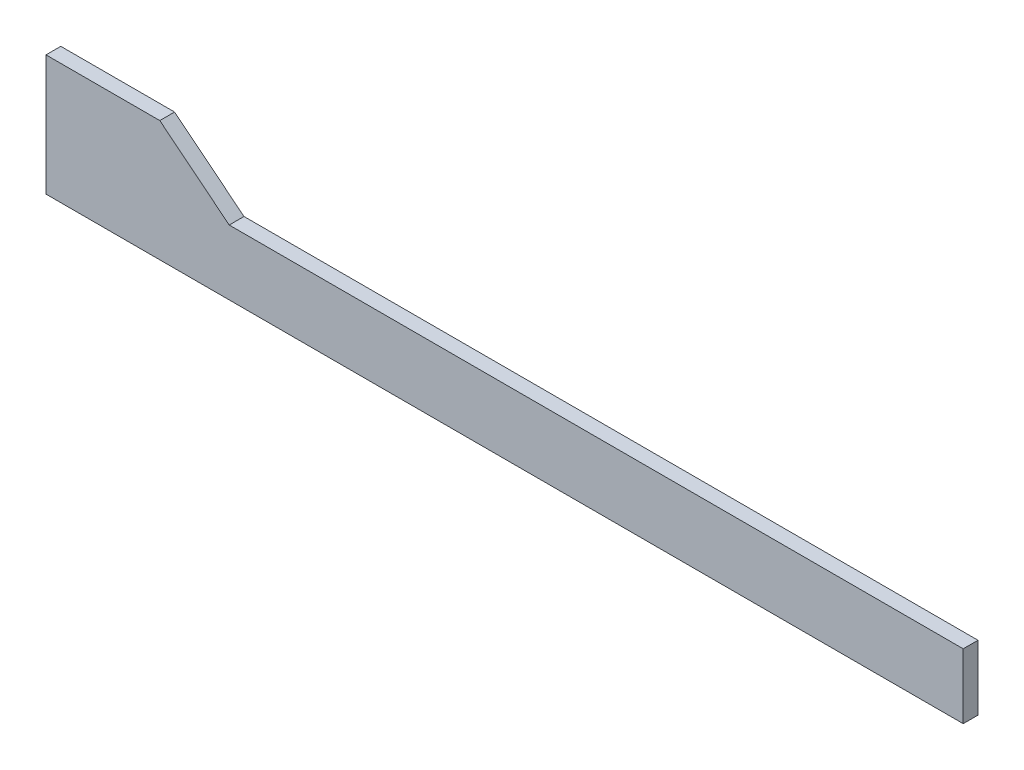
ISO-10303-21;
HEADER;
FILE_DESCRIPTION(('STEP AP214'),'2;1');
FILE_NAME('part.step','',(''),(''),'','','');
FILE_SCHEMA(('AUTOMOTIVE_DESIGN { 1 0 10303 214 1 1 1 1 }'));
ENDSEC;
DATA;
#1=APPLICATION_CONTEXT('core data for automotive mechanical design processes');
#2=APPLICATION_PROTOCOL_DEFINITION('international standard','automotive_design',2000,#1);
#3=PRODUCT_CONTEXT('',#1,'mechanical');
#4=PRODUCT('Part','Part','',(#3));
#5=PRODUCT_RELATED_PRODUCT_CATEGORY('part','',(#4));
#6=PRODUCT_DEFINITION_FORMATION('','',#4);
#7=PRODUCT_DEFINITION_CONTEXT('part definition',#1,'design');
#8=PRODUCT_DEFINITION('design','',#6,#7);
#9=PRODUCT_DEFINITION_SHAPE('','',#8);
#10=(LENGTH_UNIT() NAMED_UNIT(*) SI_UNIT(.MILLI.,.METRE.));
#11=(NAMED_UNIT(*) PLANE_ANGLE_UNIT() SI_UNIT($,.RADIAN.));
#12=(NAMED_UNIT(*) SI_UNIT($,.STERADIAN.) SOLID_ANGLE_UNIT());
#13=UNCERTAINTY_MEASURE_WITH_UNIT(LENGTH_MEASURE(1.E-05),#10,'distance_accuracy_value','');
#14=(GEOMETRIC_REPRESENTATION_CONTEXT(3) GLOBAL_UNCERTAINTY_ASSIGNED_CONTEXT((#13)) GLOBAL_UNIT_ASSIGNED_CONTEXT((#10,
#11,#12)) REPRESENTATION_CONTEXT('',''));
#15=CARTESIAN_POINT('',(0.,0.,0.));
#16=DIRECTION('',(0.,0.,1.));
#17=DIRECTION('',(1.,0.,0.));
#18=AXIS2_PLACEMENT_3D('',#15,#16,#17);
#19=CARTESIAN_POINT('',(-303.,53.,13.));
#20=DIRECTION('',(0.,-1.,0.));
#21=DIRECTION('',(1.,0.,0.));
#22=AXIS2_PLACEMENT_3D('',#19,#20,#21);
#23=PLANE('',#22);
#24=DIRECTION('',(-1.,0.,0.));
#25=VECTOR('',#24,1.);
#26=CARTESIAN_POINT('',(-303.,53.,0.));
#27=LINE('',#26,#25);
#28=CARTESIAN_POINT('',(-303.,53.,0.));
#29=VERTEX_POINT('',#28);
#30=CARTESIAN_POINT('',(-403.,53.,0.));
#31=VERTEX_POINT('',#30);
#32=EDGE_CURVE('E117',#29,#31,#27,.T.);
#33=ORIENTED_EDGE('',*,*,#32,.T.);
#34=DIRECTION('',(0.,0.,-1.));
#35=VECTOR('',#34,1.);
#36=CARTESIAN_POINT('',(-403.,53.,13.));
#37=LINE('',#36,#35);
#38=CARTESIAN_POINT('',(-403.,53.,13.));
#39=VERTEX_POINT('',#38);
#40=EDGE_CURVE('E11',#39,#31,#37,.T.);
#41=ORIENTED_EDGE('',*,*,#40,.F.);
#42=DIRECTION('',(-1.,0.,0.));
#43=VECTOR('',#42,1.);
#44=CARTESIAN_POINT('',(-303.,53.,13.));
#45=LINE('',#44,#43);
#46=CARTESIAN_POINT('',(-303.,53.,13.));
#47=VERTEX_POINT('',#46);
#48=EDGE_CURVE('E127',#47,#39,#45,.T.);
#49=ORIENTED_EDGE('',*,*,#48,.F.);
#50=DIRECTION('',(0.,0.,-1.));
#51=VECTOR('',#50,1.);
#52=CARTESIAN_POINT('',(-303.,53.,13.));
#53=LINE('',#52,#51);
#54=EDGE_CURVE('E113',#47,#29,#53,.T.);
#55=ORIENTED_EDGE('',*,*,#54,.T.);
#56=EDGE_LOOP('',(#33,#41,#49,#55));
#57=FACE_BOUND('',#56,.T.);
#58=ADVANCED_FACE('F33',(#57),#23,.F.);
#59=CARTESIAN_POINT('',(-403.,53.,13.));
#60=DIRECTION('',(1.,0.,0.));
#61=DIRECTION('',(0.,0.,-1.));
#62=AXIS2_PLACEMENT_3D('',#59,#60,#61);
#63=PLANE('',#62);
#64=DIRECTION('',(0.,-1.,0.));
#65=VECTOR('',#64,1.);
#66=CARTESIAN_POINT('',(-403.,53.,0.));
#67=LINE('',#66,#65);
#68=CARTESIAN_POINT('',(-403.,-53.,0.));
#69=VERTEX_POINT('',#68);
#70=EDGE_CURVE('E120',#31,#69,#67,.T.);
#71=ORIENTED_EDGE('',*,*,#70,.T.);
#72=DIRECTION('',(0.,0.,-1.));
#73=VECTOR('',#72,1.);
#74=CARTESIAN_POINT('',(-403.,-53.,13.));
#75=LINE('',#74,#73);
#76=CARTESIAN_POINT('',(-403.,-53.,13.));
#77=VERTEX_POINT('',#76);
#78=EDGE_CURVE('E41',#77,#69,#75,.T.);
#79=ORIENTED_EDGE('',*,*,#78,.F.);
#80=DIRECTION('',(0.,-1.,0.));
#81=VECTOR('',#80,1.);
#82=CARTESIAN_POINT('',(-403.,53.,13.));
#83=LINE('',#82,#81);
#84=EDGE_CURVE('E86',#39,#77,#83,.T.);
#85=ORIENTED_EDGE('',*,*,#84,.F.);
#86=ORIENTED_EDGE('',*,*,#40,.T.);
#87=EDGE_LOOP('',(#71,#79,#85,#86));
#88=FACE_BOUND('',#87,.T.);
#89=ADVANCED_FACE('F151',(#88),#63,.F.);
#90=CARTESIAN_POINT('',(-403.,-53.,13.));
#91=DIRECTION('',(0.,1.,0.));
#92=DIRECTION('',(0.,0.,1.));
#93=AXIS2_PLACEMENT_3D('',#90,#91,#92);
#94=PLANE('',#93);
#95=DIRECTION('',(1.,0.,0.));
#96=VECTOR('',#95,1.);
#97=CARTESIAN_POINT('',(-403.,-53.,0.));
#98=LINE('',#97,#96);
#99=CARTESIAN_POINT('',(403.,-53.,0.));
#100=VERTEX_POINT('',#99);
#101=EDGE_CURVE('E122',#69,#100,#98,.T.);
#102=ORIENTED_EDGE('',*,*,#101,.T.);
#103=DIRECTION('',(0.,0.,-1.));
#104=VECTOR('',#103,1.);
#105=CARTESIAN_POINT('',(403.,-53.,13.));
#106=LINE('',#105,#104);
#107=CARTESIAN_POINT('',(403.,-53.,13.));
#108=VERTEX_POINT('',#107);
#109=EDGE_CURVE('E108',#108,#100,#106,.T.);
#110=ORIENTED_EDGE('',*,*,#109,.F.);
#111=DIRECTION('',(1.,0.,0.));
#112=VECTOR('',#111,1.);
#113=CARTESIAN_POINT('',(-403.,-53.,13.));
#114=LINE('',#113,#112);
#115=EDGE_CURVE('E99',#77,#108,#114,.T.);
#116=ORIENTED_EDGE('',*,*,#115,.F.);
#117=ORIENTED_EDGE('',*,*,#78,.T.);
#118=EDGE_LOOP('',(#102,#110,#116,#117));
#119=FACE_BOUND('',#118,.T.);
#120=ADVANCED_FACE('F133',(#119),#94,.F.);
#121=CARTESIAN_POINT('',(403.,-53.,13.));
#122=DIRECTION('',(-1.,0.,0.));
#123=DIRECTION('',(0.,0.,1.));
#124=AXIS2_PLACEMENT_3D('',#121,#122,#123);
#125=PLANE('',#124);
#126=DIRECTION('',(0.,1.,0.));
#127=VECTOR('',#126,1.);
#128=CARTESIAN_POINT('',(403.,-53.,0.));
#129=LINE('',#128,#127);
#130=CARTESIAN_POINT('',(403.,4.,0.));
#131=VERTEX_POINT('',#130);
#132=EDGE_CURVE('E107',#100,#131,#129,.T.);
#133=ORIENTED_EDGE('',*,*,#132,.T.);
#134=DIRECTION('',(0.,0.,-1.));
#135=VECTOR('',#134,1.);
#136=CARTESIAN_POINT('',(403.,4.,13.));
#137=LINE('',#136,#135);
#138=CARTESIAN_POINT('',(403.,4.,13.));
#139=VERTEX_POINT('',#138);
#140=EDGE_CURVE('E104',#139,#131,#137,.T.);
#141=ORIENTED_EDGE('',*,*,#140,.F.);
#142=DIRECTION('',(0.,1.,0.));
#143=VECTOR('',#142,1.);
#144=CARTESIAN_POINT('',(403.,-53.,13.));
#145=LINE('',#144,#143);
#146=EDGE_CURVE('E93',#108,#139,#145,.T.);
#147=ORIENTED_EDGE('',*,*,#146,.F.);
#148=ORIENTED_EDGE('',*,*,#109,.T.);
#149=EDGE_LOOP('',(#133,#141,#147,#148));
#150=FACE_BOUND('',#149,.T.);
#151=ADVANCED_FACE('F105',(#150),#125,.F.);
#152=CARTESIAN_POINT('',(403.,4.,13.));
#153=DIRECTION('',(0.,-1.,0.));
#154=DIRECTION('',(1.,0.,0.));
#155=AXIS2_PLACEMENT_3D('',#152,#153,#154);
#156=PLANE('',#155);
#157=DIRECTION('',(-1.,0.,0.));
#158=VECTOR('',#157,1.);
#159=CARTESIAN_POINT('',(403.,4.,0.));
#160=LINE('',#159,#158);
#161=CARTESIAN_POINT('',(-242.,3.99999999999992,0.));
#162=VERTEX_POINT('',#161);
#163=EDGE_CURVE('E72',#131,#162,#160,.T.);
#164=ORIENTED_EDGE('',*,*,#163,.T.);
#165=DIRECTION('',(0.,0.,-1.));
#166=VECTOR('',#165,1.);
#167=CARTESIAN_POINT('',(-242.,3.99999999999992,13.));
#168=LINE('',#167,#166);
#169=CARTESIAN_POINT('',(-242.,3.99999999999992,13.));
#170=VERTEX_POINT('',#169);
#171=EDGE_CURVE('E109',#170,#162,#168,.T.);
#172=ORIENTED_EDGE('',*,*,#171,.F.);
#173=DIRECTION('',(-1.,0.,0.));
#174=VECTOR('',#173,1.);
#175=CARTESIAN_POINT('',(403.,4.,13.));
#176=LINE('',#175,#174);
#177=EDGE_CURVE('E97',#139,#170,#176,.T.);
#178=ORIENTED_EDGE('',*,*,#177,.F.);
#179=ORIENTED_EDGE('',*,*,#140,.T.);
#180=EDGE_LOOP('',(#164,#172,#178,#179));
#181=FACE_BOUND('',#180,.T.);
#182=ADVANCED_FACE('F111',(#181),#156,.F.);
#183=CARTESIAN_POINT('',(-242.,3.99999999999992,13.));
#184=DIRECTION('',(-0.626252420423985,-0.779620360119655,0.));
#185=DIRECTION('',(0.779620360119655,-0.626252420423985,0.));
#186=AXIS2_PLACEMENT_3D('',#183,#184,#185);
#187=PLANE('',#186);
#188=DIRECTION('',(-0.779620360119655,0.626252420423985,0.));
#189=VECTOR('',#188,1.);
#190=CARTESIAN_POINT('',(-242.,3.99999999999992,0.));
#191=LINE('',#190,#189);
#192=EDGE_CURVE('E78',#162,#29,#191,.T.);
#193=ORIENTED_EDGE('',*,*,#192,.T.);
#194=ORIENTED_EDGE('',*,*,#54,.F.);
#195=DIRECTION('',(-0.779620360119655,0.626252420423985,0.));
#196=VECTOR('',#195,1.);
#197=CARTESIAN_POINT('',(-242.,3.99999999999992,13.));
#198=LINE('',#197,#196);
#199=EDGE_CURVE('E49',#170,#47,#198,.T.);
#200=ORIENTED_EDGE('',*,*,#199,.F.);
#201=ORIENTED_EDGE('',*,*,#171,.T.);
#202=EDGE_LOOP('',(#193,#194,#200,#201));
#203=FACE_BOUND('',#202,.T.);
#204=ADVANCED_FACE('F140',(#203),#187,.F.);
#205=CARTESIAN_POINT('',(0.,0.,13.));
#206=DIRECTION('',(0.,0.,1.));
#207=DIRECTION('',(1.,0.,0.));
#208=AXIS2_PLACEMENT_3D('',#205,#206,#207);
#209=PLANE('',#208);
#210=ORIENTED_EDGE('',*,*,#48,.T.);
#211=ORIENTED_EDGE('',*,*,#84,.T.);
#212=ORIENTED_EDGE('',*,*,#115,.T.);
#213=ORIENTED_EDGE('',*,*,#146,.T.);
#214=ORIENTED_EDGE('',*,*,#177,.T.);
#215=ORIENTED_EDGE('',*,*,#199,.T.);
#216=EDGE_LOOP('',(#210,#211,#212,#213,#214,#215));
#217=FACE_BOUND('',#216,.T.);
#218=ADVANCED_FACE('F95',(#217),#209,.T.);
#219=CARTESIAN_POINT('',(0.,0.,0.));
#220=DIRECTION('',(0.,0.,1.));
#221=DIRECTION('',(1.,0.,0.));
#222=AXIS2_PLACEMENT_3D('',#219,#220,#221);
#223=PLANE('',#222);
#224=ORIENTED_EDGE('',*,*,#32,.F.);
#225=ORIENTED_EDGE('',*,*,#192,.F.);
#226=ORIENTED_EDGE('',*,*,#163,.F.);
#227=ORIENTED_EDGE('',*,*,#132,.F.);
#228=ORIENTED_EDGE('',*,*,#101,.F.);
#229=ORIENTED_EDGE('',*,*,#70,.F.);
#230=EDGE_LOOP('',(#224,#225,#226,#227,#228,#229));
#231=FACE_BOUND('',#230,.T.);
#232=ADVANCED_FACE('F136',(#231),#223,.F.);
#233=CLOSED_SHELL('',(#58,#89,#120,#151,#182,#204,#218,#232));
#234=MANIFOLD_SOLID_BREP('B2',#233);
#235=ADVANCED_BREP_SHAPE_REPRESENTATION('',(#18,#234),#14);
#236=SHAPE_DEFINITION_REPRESENTATION(#9,#235);
ENDSEC;
END-ISO-10303-21;
